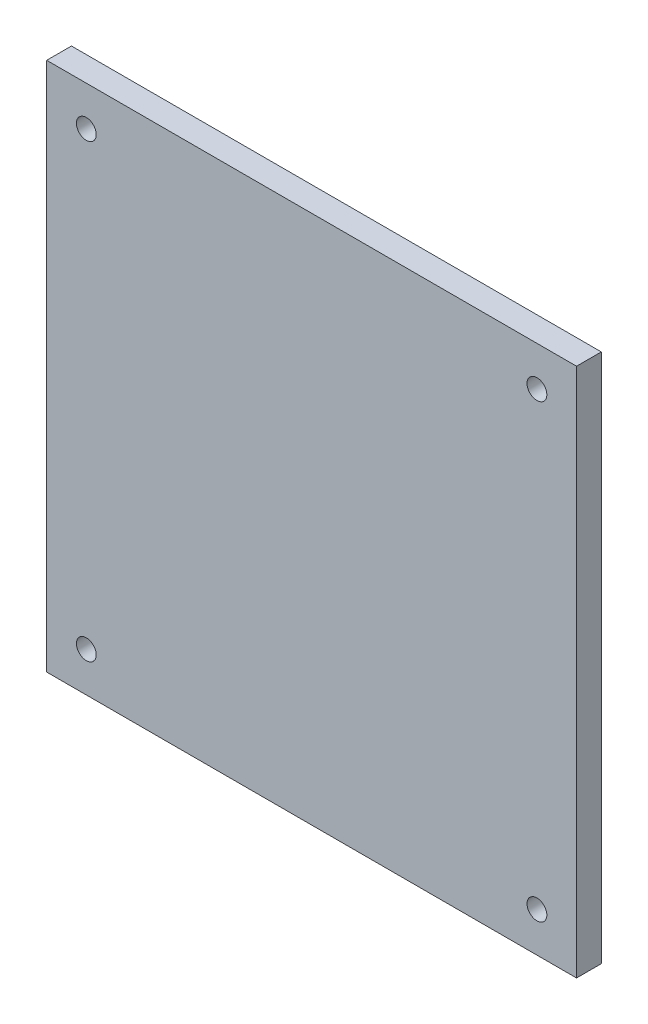
ISO-10303-21;
HEADER;
FILE_DESCRIPTION(('STEP AP214'),'2;1');
FILE_NAME('part.step','',(''),(''),'','','');
FILE_SCHEMA(('AUTOMOTIVE_DESIGN { 1 0 10303 214 1 1 1 1 }'));
ENDSEC;
DATA;
#1=APPLICATION_CONTEXT('core data for automotive mechanical design processes');
#2=APPLICATION_PROTOCOL_DEFINITION('international standard','automotive_design',2000,#1);
#3=PRODUCT_CONTEXT('',#1,'mechanical');
#4=PRODUCT('Part','Part','',(#3));
#5=PRODUCT_RELATED_PRODUCT_CATEGORY('part','',(#4));
#6=PRODUCT_DEFINITION_FORMATION('','',#4);
#7=PRODUCT_DEFINITION_CONTEXT('part definition',#1,'design');
#8=PRODUCT_DEFINITION('design','',#6,#7);
#9=PRODUCT_DEFINITION_SHAPE('','',#8);
#10=(LENGTH_UNIT() NAMED_UNIT(*) SI_UNIT(.MILLI.,.METRE.));
#11=(NAMED_UNIT(*) PLANE_ANGLE_UNIT() SI_UNIT($,.RADIAN.));
#12=(NAMED_UNIT(*) SI_UNIT($,.STERADIAN.) SOLID_ANGLE_UNIT());
#13=UNCERTAINTY_MEASURE_WITH_UNIT(LENGTH_MEASURE(1.E-05),#10,'distance_accuracy_value','');
#14=(GEOMETRIC_REPRESENTATION_CONTEXT(3) GLOBAL_UNCERTAINTY_ASSIGNED_CONTEXT((#13)) GLOBAL_UNIT_ASSIGNED_CONTEXT((#10,
#11,#12)) REPRESENTATION_CONTEXT('',''));
#15=CARTESIAN_POINT('',(0.,0.,0.));
#16=DIRECTION('',(0.,0.,1.));
#17=DIRECTION('',(1.,0.,0.));
#18=AXIS2_PLACEMENT_3D('',#15,#16,#17);
#19=CARTESIAN_POINT('',(53.5,53.5,5.));
#20=DIRECTION('',(-1.,0.,0.));
#21=DIRECTION('',(0.,-1.,0.));
#22=AXIS2_PLACEMENT_3D('',#19,#20,#21);
#23=PLANE('',#22);
#24=DIRECTION('',(0.,1.,0.));
#25=VECTOR('',#24,1.);
#26=CARTESIAN_POINT('',(53.5,53.5,0.));
#27=LINE('',#26,#25);
#28=CARTESIAN_POINT('',(53.5,-53.5,0.));
#29=VERTEX_POINT('',#28);
#30=CARTESIAN_POINT('',(53.5,53.5,0.));
#31=VERTEX_POINT('',#30);
#32=EDGE_CURVE('E102',#29,#31,#27,.T.);
#33=ORIENTED_EDGE('',*,*,#32,.T.);
#34=DIRECTION('',(0.,0.,-1.));
#35=VECTOR('',#34,1.);
#36=CARTESIAN_POINT('',(53.5,53.5,5.));
#37=LINE('',#36,#35);
#38=CARTESIAN_POINT('',(53.5,53.5,5.));
#39=VERTEX_POINT('',#38);
#40=EDGE_CURVE('E11',#39,#31,#37,.T.);
#41=ORIENTED_EDGE('',*,*,#40,.F.);
#42=DIRECTION('',(0.,1.,0.));
#43=VECTOR('',#42,1.);
#44=CARTESIAN_POINT('',(53.5,53.5,5.));
#45=LINE('',#44,#43);
#46=CARTESIAN_POINT('',(53.5,-53.5,5.));
#47=VERTEX_POINT('',#46);
#48=EDGE_CURVE('E90',#47,#39,#45,.T.);
#49=ORIENTED_EDGE('',*,*,#48,.F.);
#50=DIRECTION('',(0.,0.,-1.));
#51=VECTOR('',#50,1.);
#52=CARTESIAN_POINT('',(53.5,-53.5,5.));
#53=LINE('',#52,#51);
#54=EDGE_CURVE('E98',#47,#29,#53,.T.);
#55=ORIENTED_EDGE('',*,*,#54,.T.);
#56=EDGE_LOOP('',(#33,#41,#49,#55));
#57=FACE_BOUND('',#56,.T.);
#58=ADVANCED_FACE('F39',(#57),#23,.F.);
#59=CARTESIAN_POINT('',(-53.5,53.5,5.));
#60=DIRECTION('',(0.,-1.,0.));
#61=DIRECTION('',(0.,0.,-1.));
#62=AXIS2_PLACEMENT_3D('',#59,#60,#61);
#63=PLANE('',#62);
#64=DIRECTION('',(-1.,0.,0.));
#65=VECTOR('',#64,1.);
#66=CARTESIAN_POINT('',(-53.5,53.5,0.));
#67=LINE('',#66,#65);
#68=CARTESIAN_POINT('',(-53.5,53.5,0.));
#69=VERTEX_POINT('',#68);
#70=EDGE_CURVE('E94',#31,#69,#67,.T.);
#71=ORIENTED_EDGE('',*,*,#70,.T.);
#72=DIRECTION('',(0.,0.,-1.));
#73=VECTOR('',#72,1.);
#74=CARTESIAN_POINT('',(-53.5,53.5,5.));
#75=LINE('',#74,#73);
#76=CARTESIAN_POINT('',(-53.5,53.5,5.));
#77=VERTEX_POINT('',#76);
#78=EDGE_CURVE('E47',#77,#69,#75,.T.);
#79=ORIENTED_EDGE('',*,*,#78,.F.);
#80=DIRECTION('',(-1.,0.,0.));
#81=VECTOR('',#80,1.);
#82=CARTESIAN_POINT('',(-53.5,53.5,5.));
#83=LINE('',#82,#81);
#84=EDGE_CURVE('E85',#39,#77,#83,.T.);
#85=ORIENTED_EDGE('',*,*,#84,.F.);
#86=ORIENTED_EDGE('',*,*,#40,.T.);
#87=EDGE_LOOP('',(#71,#79,#85,#86));
#88=FACE_BOUND('',#87,.T.);
#89=ADVANCED_FACE('F93',(#88),#63,.F.);
#90=CARTESIAN_POINT('',(-53.5,53.5,5.));
#91=DIRECTION('',(1.,0.,0.));
#92=DIRECTION('',(0.,1.,0.));
#93=AXIS2_PLACEMENT_3D('',#90,#91,#92);
#94=PLANE('',#93);
#95=DIRECTION('',(0.,-1.,0.));
#96=VECTOR('',#95,1.);
#97=CARTESIAN_POINT('',(-53.5,53.5,0.));
#98=LINE('',#97,#96);
#99=CARTESIAN_POINT('',(-53.5,-53.5,0.));
#100=VERTEX_POINT('',#99);
#101=EDGE_CURVE('E72',#69,#100,#98,.T.);
#102=ORIENTED_EDGE('',*,*,#101,.T.);
#103=DIRECTION('',(0.,0.,-1.));
#104=VECTOR('',#103,1.);
#105=CARTESIAN_POINT('',(-53.5,-53.5,5.));
#106=LINE('',#105,#104);
#107=CARTESIAN_POINT('',(-53.5,-53.5,5.));
#108=VERTEX_POINT('',#107);
#109=EDGE_CURVE('E95',#108,#100,#106,.T.);
#110=ORIENTED_EDGE('',*,*,#109,.F.);
#111=DIRECTION('',(0.,-1.,0.));
#112=VECTOR('',#111,1.);
#113=CARTESIAN_POINT('',(-53.5,53.5,5.));
#114=LINE('',#113,#112);
#115=EDGE_CURVE('E88',#77,#108,#114,.T.);
#116=ORIENTED_EDGE('',*,*,#115,.F.);
#117=ORIENTED_EDGE('',*,*,#78,.T.);
#118=EDGE_LOOP('',(#102,#110,#116,#117));
#119=FACE_BOUND('',#118,.T.);
#120=ADVANCED_FACE('F96',(#119),#94,.F.);
#121=CARTESIAN_POINT('',(-53.5,-53.5,5.));
#122=DIRECTION('',(0.,1.,0.));
#123=DIRECTION('',(0.,0.,1.));
#124=AXIS2_PLACEMENT_3D('',#121,#122,#123);
#125=PLANE('',#124);
#126=DIRECTION('',(1.,0.,0.));
#127=VECTOR('',#126,1.);
#128=CARTESIAN_POINT('',(-53.5,-53.5,0.));
#129=LINE('',#128,#127);
#130=EDGE_CURVE('E78',#100,#29,#129,.T.);
#131=ORIENTED_EDGE('',*,*,#130,.T.);
#132=ORIENTED_EDGE('',*,*,#54,.F.);
#133=DIRECTION('',(1.,0.,0.));
#134=VECTOR('',#133,1.);
#135=CARTESIAN_POINT('',(-53.5,-53.5,5.));
#136=LINE('',#135,#134);
#137=EDGE_CURVE('E55',#108,#47,#136,.T.);
#138=ORIENTED_EDGE('',*,*,#137,.F.);
#139=ORIENTED_EDGE('',*,*,#109,.T.);
#140=EDGE_LOOP('',(#131,#132,#138,#139));
#141=FACE_BOUND('',#140,.T.);
#142=ADVANCED_FACE('F110',(#141),#125,.F.);
#143=CARTESIAN_POINT('',(0.,0.,5.));
#144=DIRECTION('',(0.,0.,1.));
#145=DIRECTION('',(1.,0.,0.));
#146=AXIS2_PLACEMENT_3D('',#143,#144,#145);
#147=PLANE('',#146);
#148=CARTESIAN_POINT('',(45.5,45.5,5.));
#149=DIRECTION('',(0.,0.,1.));
#150=DIRECTION('',(-1.,0.,0.));
#151=AXIS2_PLACEMENT_3D('',#148,#149,#150);
#152=CIRCLE('',#151,2.);
#153=CARTESIAN_POINT('',(43.5,45.5,5.));
#154=VERTEX_POINT('',#153);
#155=EDGE_CURVE('E125',#154,#154,#152,.T.);
#156=ORIENTED_EDGE('',*,*,#155,.F.);
#157=EDGE_LOOP('',(#156));
#158=FACE_BOUND('',#157,.T.);
#159=CARTESIAN_POINT('',(45.5,-45.5,5.));
#160=DIRECTION('',(0.,0.,1.));
#161=DIRECTION('',(1.,0.,0.));
#162=AXIS2_PLACEMENT_3D('',#159,#160,#161);
#163=CIRCLE('',#162,2.);
#164=CARTESIAN_POINT('',(47.5,-45.5,5.));
#165=VERTEX_POINT('',#164);
#166=EDGE_CURVE('E131',#165,#165,#163,.T.);
#167=ORIENTED_EDGE('',*,*,#166,.F.);
#168=EDGE_LOOP('',(#167));
#169=FACE_BOUND('',#168,.T.);
#170=CARTESIAN_POINT('',(-45.5,-45.5,5.));
#171=DIRECTION('',(0.,0.,1.));
#172=DIRECTION('',(-1.,0.,0.));
#173=AXIS2_PLACEMENT_3D('',#170,#171,#172);
#174=CIRCLE('',#173,2.);
#175=CARTESIAN_POINT('',(-47.5,-45.5,5.));
#176=VERTEX_POINT('',#175);
#177=EDGE_CURVE('E119',#176,#176,#174,.T.);
#178=ORIENTED_EDGE('',*,*,#177,.F.);
#179=EDGE_LOOP('',(#178));
#180=FACE_BOUND('',#179,.T.);
#181=CARTESIAN_POINT('',(-45.5,45.5,5.));
#182=DIRECTION('',(0.,0.,1.));
#183=DIRECTION('',(1.,0.,0.));
#184=AXIS2_PLACEMENT_3D('',#181,#182,#183);
#185=CIRCLE('',#184,2.);
#186=CARTESIAN_POINT('',(-43.5,45.5,5.));
#187=VERTEX_POINT('',#186);
#188=EDGE_CURVE('E116',#187,#187,#185,.T.);
#189=ORIENTED_EDGE('',*,*,#188,.F.);
#190=EDGE_LOOP('',(#189));
#191=FACE_BOUND('',#190,.T.);
#192=ORIENTED_EDGE('',*,*,#48,.T.);
#193=ORIENTED_EDGE('',*,*,#84,.T.);
#194=ORIENTED_EDGE('',*,*,#115,.T.);
#195=ORIENTED_EDGE('',*,*,#137,.T.);
#196=EDGE_LOOP('',(#192,#193,#194,#195));
#197=FACE_BOUND('',#196,.T.);
#198=ADVANCED_FACE('F86',(#158,#169,#180,#191,#197),#147,.T.);
#199=CARTESIAN_POINT('',(0.,0.,0.));
#200=DIRECTION('',(0.,0.,1.));
#201=DIRECTION('',(1.,0.,0.));
#202=AXIS2_PLACEMENT_3D('',#199,#200,#201);
#203=PLANE('',#202);
#204=CARTESIAN_POINT('',(45.5,45.5,0.));
#205=DIRECTION('',(0.,0.,1.));
#206=DIRECTION('',(-1.,0.,0.));
#207=AXIS2_PLACEMENT_3D('',#204,#205,#206);
#208=CIRCLE('',#207,2.);
#209=CARTESIAN_POINT('',(43.5,45.5,0.));
#210=VERTEX_POINT('',#209);
#211=EDGE_CURVE('E122',#210,#210,#208,.T.);
#212=ORIENTED_EDGE('',*,*,#211,.T.);
#213=EDGE_LOOP('',(#212));
#214=FACE_BOUND('',#213,.T.);
#215=CARTESIAN_POINT('',(45.5,-45.5,0.));
#216=DIRECTION('',(0.,0.,1.));
#217=DIRECTION('',(1.,0.,0.));
#218=AXIS2_PLACEMENT_3D('',#215,#216,#217);
#219=CIRCLE('',#218,2.);
#220=CARTESIAN_POINT('',(47.5,-45.5,0.));
#221=VERTEX_POINT('',#220);
#222=EDGE_CURVE('E128',#221,#221,#219,.T.);
#223=ORIENTED_EDGE('',*,*,#222,.T.);
#224=EDGE_LOOP('',(#223));
#225=FACE_BOUND('',#224,.T.);
#226=CARTESIAN_POINT('',(-45.5,-45.5,0.));
#227=DIRECTION('',(0.,0.,1.));
#228=DIRECTION('',(-1.,0.,0.));
#229=AXIS2_PLACEMENT_3D('',#226,#227,#228);
#230=CIRCLE('',#229,2.);
#231=CARTESIAN_POINT('',(-47.5,-45.5,0.));
#232=VERTEX_POINT('',#231);
#233=EDGE_CURVE('E134',#232,#232,#230,.T.);
#234=ORIENTED_EDGE('',*,*,#233,.T.);
#235=EDGE_LOOP('',(#234));
#236=FACE_BOUND('',#235,.T.);
#237=CARTESIAN_POINT('',(-45.5,45.5,0.));
#238=DIRECTION('',(0.,0.,1.));
#239=DIRECTION('',(1.,0.,0.));
#240=AXIS2_PLACEMENT_3D('',#237,#238,#239);
#241=CIRCLE('',#240,2.);
#242=CARTESIAN_POINT('',(-43.5,45.5,0.));
#243=VERTEX_POINT('',#242);
#244=EDGE_CURVE('E105',#243,#243,#241,.T.);
#245=ORIENTED_EDGE('',*,*,#244,.T.);
#246=EDGE_LOOP('',(#245));
#247=FACE_BOUND('',#246,.T.);
#248=ORIENTED_EDGE('',*,*,#32,.F.);
#249=ORIENTED_EDGE('',*,*,#130,.F.);
#250=ORIENTED_EDGE('',*,*,#101,.F.);
#251=ORIENTED_EDGE('',*,*,#70,.F.);
#252=EDGE_LOOP('',(#248,#249,#250,#251));
#253=FACE_BOUND('',#252,.T.);
#254=ADVANCED_FACE('F113',(#214,#225,#236,#247,#253),#203,.F.);
#255=CARTESIAN_POINT('',(-45.5,45.5,0.));
#256=DIRECTION('',(0.,0.,1.));
#257=DIRECTION('',(1.,0.,0.));
#258=AXIS2_PLACEMENT_3D('',#255,#256,#257);
#259=CYLINDRICAL_SURFACE('',#258,2.);
#260=ORIENTED_EDGE('',*,*,#244,.F.);
#261=EDGE_LOOP('',(#260));
#262=FACE_BOUND('',#261,.T.);
#263=ORIENTED_EDGE('',*,*,#188,.T.);
#264=EDGE_LOOP('',(#263));
#265=FACE_BOUND('',#264,.T.);
#266=ADVANCED_FACE('F148',(#262,#265),#259,.F.);
#267=CARTESIAN_POINT('',(-45.5,-45.5,0.));
#268=DIRECTION('',(0.,0.,1.));
#269=DIRECTION('',(1.,0.,0.));
#270=AXIS2_PLACEMENT_3D('',#267,#268,#269);
#271=CYLINDRICAL_SURFACE('',#270,2.);
#272=ORIENTED_EDGE('',*,*,#233,.F.);
#273=EDGE_LOOP('',(#272));
#274=FACE_BOUND('',#273,.T.);
#275=ORIENTED_EDGE('',*,*,#177,.T.);
#276=EDGE_LOOP('',(#275));
#277=FACE_BOUND('',#276,.T.);
#278=ADVANCED_FACE('F140',(#274,#277),#271,.F.);
#279=CARTESIAN_POINT('',(45.5,-45.5,0.));
#280=DIRECTION('',(0.,0.,1.));
#281=DIRECTION('',(1.,0.,0.));
#282=AXIS2_PLACEMENT_3D('',#279,#280,#281);
#283=CYLINDRICAL_SURFACE('',#282,2.);
#284=ORIENTED_EDGE('',*,*,#222,.F.);
#285=EDGE_LOOP('',(#284));
#286=FACE_BOUND('',#285,.T.);
#287=ORIENTED_EDGE('',*,*,#166,.T.);
#288=EDGE_LOOP('',(#287));
#289=FACE_BOUND('',#288,.T.);
#290=ADVANCED_FACE('F156',(#286,#289),#283,.F.);
#291=CARTESIAN_POINT('',(45.5,45.5,0.));
#292=DIRECTION('',(0.,0.,1.));
#293=DIRECTION('',(1.,0.,0.));
#294=AXIS2_PLACEMENT_3D('',#291,#292,#293);
#295=CYLINDRICAL_SURFACE('',#294,2.);
#296=ORIENTED_EDGE('',*,*,#211,.F.);
#297=EDGE_LOOP('',(#296));
#298=FACE_BOUND('',#297,.T.);
#299=ORIENTED_EDGE('',*,*,#155,.T.);
#300=EDGE_LOOP('',(#299));
#301=FACE_BOUND('',#300,.T.);
#302=ADVANCED_FACE('F207',(#298,#301),#295,.F.);
#303=CLOSED_SHELL('',(#58,#89,#120,#142,#198,#254,#266,#278,#290,#302));
#304=MANIFOLD_SOLID_BREP('B2',#303);
#305=ADVANCED_BREP_SHAPE_REPRESENTATION('',(#18,#304),#14);
#306=SHAPE_DEFINITION_REPRESENTATION(#9,#305);
ENDSEC;
END-ISO-10303-21;
